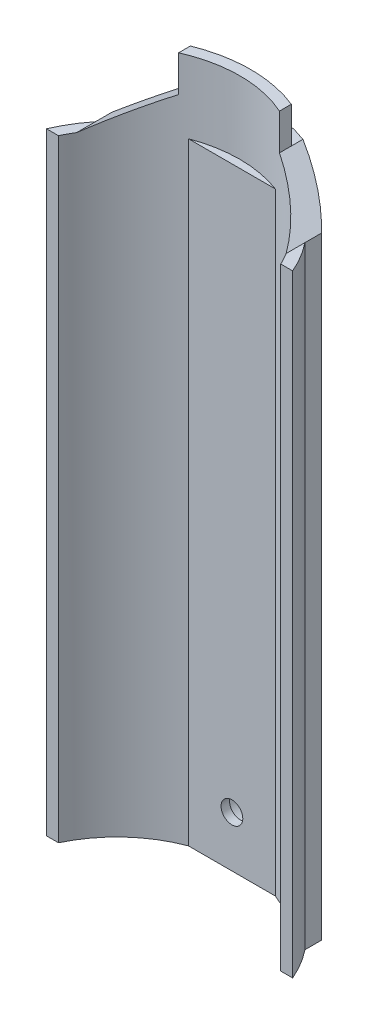
ISO-10303-21;
HEADER;
FILE_DESCRIPTION(('STEP AP214'),'2;1');
FILE_NAME('part.step','',(''),(''),'','','');
FILE_SCHEMA(('AUTOMOTIVE_DESIGN { 1 0 10303 214 1 1 1 1 }'));
ENDSEC;
DATA;
#1=APPLICATION_CONTEXT('core data for automotive mechanical design processes');
#2=APPLICATION_PROTOCOL_DEFINITION('international standard','automotive_design',2000,#1);
#3=PRODUCT_CONTEXT('',#1,'mechanical');
#4=PRODUCT('Part','Part','',(#3));
#5=PRODUCT_RELATED_PRODUCT_CATEGORY('part','',(#4));
#6=PRODUCT_DEFINITION_FORMATION('','',#4);
#7=PRODUCT_DEFINITION_CONTEXT('part definition',#1,'design');
#8=PRODUCT_DEFINITION('design','',#6,#7);
#9=PRODUCT_DEFINITION_SHAPE('','',#8);
#10=(LENGTH_UNIT() NAMED_UNIT(*) SI_UNIT(.MILLI.,.METRE.));
#11=(NAMED_UNIT(*) PLANE_ANGLE_UNIT() SI_UNIT($,.RADIAN.));
#12=(NAMED_UNIT(*) SI_UNIT($,.STERADIAN.) SOLID_ANGLE_UNIT());
#13=UNCERTAINTY_MEASURE_WITH_UNIT(LENGTH_MEASURE(1.E-05),#10,'distance_accuracy_value','');
#14=(GEOMETRIC_REPRESENTATION_CONTEXT(3) GLOBAL_UNCERTAINTY_ASSIGNED_CONTEXT((#13)) GLOBAL_UNIT_ASSIGNED_CONTEXT((#10,
#11,#12)) REPRESENTATION_CONTEXT('',''));
#15=CARTESIAN_POINT('',(0.,0.,0.));
#16=DIRECTION('',(0.,0.,1.));
#17=DIRECTION('',(1.,0.,0.));
#18=AXIS2_PLACEMENT_3D('',#15,#16,#17);
#19=CARTESIAN_POINT('',(0.,6.,-19.0787840283389));
#20=DIRECTION('',(0.,0.,-1.));
#21=DIRECTION('',(-1.,0.,0.));
#22=AXIS2_PLACEMENT_3D('',#19,#20,#21);
#23=PLANE('',#22);
#24=CARTESIAN_POINT('',(0.,-1.98446247560466,-19.0787840283389));
#25=DIRECTION('',(0.,0.,-1.));
#26=DIRECTION('',(-1.,0.,0.));
#27=AXIS2_PLACEMENT_3D('',#24,#25,#26);
#28=CIRCLE('',#27,2.6);
#29=CARTESIAN_POINT('',(-2.6,-1.98446247560466,-19.0787840283389));
#30=VERTEX_POINT('',#29);
#31=EDGE_CURVE('E445',#30,#30,#28,.T.);
#32=ORIENTED_EDGE('',*,*,#31,.F.);
#33=EDGE_LOOP('',(#32));
#34=FACE_BOUND('',#33,.T.);
#35=DIRECTION('',(0.,-1.,0.));
#36=VECTOR('',#35,1.);
#37=CARTESIAN_POINT('',(-6.,6.,-19.0787840283389));
#38=LINE('',#37,#36);
#39=CARTESIAN_POINT('',(-6.,1.25,-19.0787840283389));
#40=VERTEX_POINT('',#39);
#41=CARTESIAN_POINT('',(-6.,-9.,-19.0787840283389));
#42=VERTEX_POINT('',#41);
#43=EDGE_CURVE('E198',#40,#42,#38,.T.);
#44=ORIENTED_EDGE('',*,*,#43,.F.);
#45=DIRECTION('',(-0.64413574578278,-0.764911198117051,0.));
#46=VECTOR('',#45,1.);
#47=CARTESIAN_POINT('',(-1.17017828200972,6.98541329011345,-19.0787840283389));
#48=LINE('',#47,#46);
#49=CARTESIAN_POINT('',(-2.,6.,-19.0787840283389));
#50=VERTEX_POINT('',#49);
#51=EDGE_CURVE('E188',#50,#40,#48,.T.);
#52=ORIENTED_EDGE('',*,*,#51,.F.);
#53=DIRECTION('',(1.,0.,0.));
#54=VECTOR('',#53,1.);
#55=CARTESIAN_POINT('',(0.,6.,-19.0787840283389));
#56=LINE('',#55,#54);
#57=CARTESIAN_POINT('',(2.,6.,-19.0787840283389));
#58=VERTEX_POINT('',#57);
#59=EDGE_CURVE('E197',#50,#58,#56,.T.);
#60=ORIENTED_EDGE('',*,*,#59,.T.);
#61=DIRECTION('',(-0.64413574578278,0.764911198117051,0.));
#62=VECTOR('',#61,1.);
#63=CARTESIAN_POINT('',(1.17017828200973,6.98541329011345,-19.0787840283389));
#64=LINE('',#63,#62);
#65=CARTESIAN_POINT('',(6.,1.25,-19.0787840283389));
#66=VERTEX_POINT('',#65);
#67=EDGE_CURVE('E452',#66,#58,#64,.T.);
#68=ORIENTED_EDGE('',*,*,#67,.F.);
#69=DIRECTION('',(0.,-1.,0.));
#70=VECTOR('',#69,1.);
#71=CARTESIAN_POINT('',(6.,6.,-19.0787840283389));
#72=LINE('',#71,#70);
#73=CARTESIAN_POINT('',(6.,-9.,-19.0787840283389));
#74=VERTEX_POINT('',#73);
#75=EDGE_CURVE('E68',#66,#74,#72,.T.);
#76=ORIENTED_EDGE('',*,*,#75,.T.);
#77=DIRECTION('',(1.,0.,0.));
#78=VECTOR('',#77,1.);
#79=CARTESIAN_POINT('',(0.,-9.,-19.0787840283389));
#80=LINE('',#79,#78);
#81=EDGE_CURVE('E208',#42,#74,#80,.T.);
#82=ORIENTED_EDGE('',*,*,#81,.F.);
#83=EDGE_LOOP('',(#44,#52,#60,#68,#76,#82));
#84=FACE_BOUND('',#83,.T.);
#85=ADVANCED_FACE('F43',(#34,#84),#23,.T.);
#86=CARTESIAN_POINT('',(0.,6.,0.));
#87=DIRECTION('',(0.,1.,0.));
#88=DIRECTION('',(0.,0.,1.));
#89=AXIS2_PLACEMENT_3D('',#86,#87,#88);
#90=PLANE('',#89);
#91=DIRECTION('',(0.,0.,1.));
#92=VECTOR('',#91,1.);
#93=CARTESIAN_POINT('',(-2.,6.,-20.001));
#94=LINE('',#93,#92);
#95=CARTESIAN_POINT('',(-2.,6.00000000000001,-19.8997487421324));
#96=VERTEX_POINT('',#95);
#97=EDGE_CURVE('E185',#96,#50,#94,.T.);
#98=ORIENTED_EDGE('',*,*,#97,.F.);
#99=CARTESIAN_POINT('',(0.,6.,0.));
#100=DIRECTION('',(0.,1.,0.));
#101=DIRECTION('',(0.,0.,1.));
#102=AXIS2_PLACEMENT_3D('',#99,#100,#101);
#103=CIRCLE('',#102,20.);
#104=CARTESIAN_POINT('',(2.,6.,-19.8997487421324));
#105=VERTEX_POINT('',#104);
#106=EDGE_CURVE('E203',#105,#96,#103,.T.);
#107=ORIENTED_EDGE('',*,*,#106,.F.);
#108=DIRECTION('',(0.,0.,1.));
#109=VECTOR('',#108,1.);
#110=CARTESIAN_POINT('',(2.,6.,-20.001));
#111=LINE('',#110,#109);
#112=EDGE_CURVE('E60',#105,#58,#111,.T.);
#113=ORIENTED_EDGE('',*,*,#112,.T.);
#114=ORIENTED_EDGE('',*,*,#59,.F.);
#115=EDGE_LOOP('',(#98,#107,#113,#114));
#116=FACE_BOUND('',#115,.T.);
#117=ADVANCED_FACE('F201',(#116),#90,.F.);
#118=CARTESIAN_POINT('',(0.,-1.98446247560466,-20.));
#119=DIRECTION('',(0.,0.,1.));
#120=DIRECTION('',(1.,0.,0.));
#121=AXIS2_PLACEMENT_3D('',#118,#119,#120);
#122=CYLINDRICAL_SURFACE('',#121,1.5);
#123=CARTESIAN_POINT('',(0.,-1.98446247560466,-15.9059737205869));
#124=DIRECTION('',(0.,0.,-1.));
#125=DIRECTION('',(-1.,0.,0.));
#126=AXIS2_PLACEMENT_3D('',#123,#124,#125);
#127=CIRCLE('',#126,1.5);
#128=CARTESIAN_POINT('',(-1.5,-1.98446247560466,-15.9059737205869));
#129=VERTEX_POINT('',#128);
#130=EDGE_CURVE('E213',#129,#129,#127,.T.);
#131=ORIENTED_EDGE('',*,*,#130,.F.);
#132=EDGE_LOOP('',(#131));
#133=FACE_BOUND('',#132,.T.);
#134=CARTESIAN_POINT('',(0.,-1.98446247560466,-17.0787840283389));
#135=DIRECTION('',(0.,0.,-1.));
#136=DIRECTION('',(-1.,0.,0.));
#137=AXIS2_PLACEMENT_3D('',#134,#135,#136);
#138=CIRCLE('',#137,1.5);
#139=CARTESIAN_POINT('',(-1.5,-1.98446247560466,-17.0787840283389));
#140=VERTEX_POINT('',#139);
#141=EDGE_CURVE('E47',#140,#140,#138,.F.);
#142=ORIENTED_EDGE('',*,*,#141,.F.);
#143=EDGE_LOOP('',(#142));
#144=FACE_BOUND('',#143,.T.);
#145=ADVANCED_FACE('F469',(#133,#144),#122,.F.);
#146=CARTESIAN_POINT('',(0.,80.6,0.));
#147=DIRECTION('',(0.,-1.,0.));
#148=DIRECTION('',(0.,0.,-1.));
#149=AXIS2_PLACEMENT_3D('',#146,#147,#148);
#150=CYLINDRICAL_SURFACE('',#149,20.);
#151=CARTESIAN_POINT('',(0.,8.37500000000001,0.));
#152=DIRECTION('',(-0.764911198117051,0.64413574578278,0.));
#153=DIRECTION('',(-0.64413574578278,-0.764911198117051,0.));
#154=AXIS2_PLACEMENT_3D('',#151,#152,#153);
#155=ELLIPSE('',#154,31.0493558709356,20.);
#156=EDGE_CURVE('E190',#40,#96,#155,.F.);
#157=ORIENTED_EDGE('',*,*,#156,.F.);
#158=ORIENTED_EDGE('',*,*,#43,.T.);
#159=CARTESIAN_POINT('',(0.,-9.,0.));
#160=DIRECTION('',(0.,1.,0.));
#161=DIRECTION('',(0.,0.,1.));
#162=AXIS2_PLACEMENT_3D('',#159,#160,#161);
#163=CIRCLE('',#162,20.);
#164=CARTESIAN_POINT('',(-14.47,-9.,-13.8064876054701));
#165=VERTEX_POINT('',#164);
#166=EDGE_CURVE('E237',#42,#165,#163,.T.);
#167=ORIENTED_EDGE('',*,*,#166,.T.);
#168=DIRECTION('',(0.,-1.,0.));
#169=VECTOR('',#168,1.);
#170=CARTESIAN_POINT('',(-14.47,80.6,-13.8064876054701));
#171=LINE('',#170,#169);
#172=CARTESIAN_POINT('',(-14.47,75.6,-13.8064876054701));
#173=VERTEX_POINT('',#172);
#174=EDGE_CURVE('E370',#165,#173,#171,.F.);
#175=ORIENTED_EDGE('',*,*,#174,.T.);
#176=CARTESIAN_POINT('',(0.,85.2466666666667,0.));
#177=DIRECTION('',(0.554700196225229,-0.832050294337843,0.));
#178=DIRECTION('',(-0.832050294337843,-0.554700196225229,0.));
#179=AXIS2_PLACEMENT_3D('',#176,#177,#178);
#180=ELLIPSE('',#179,24.0370085030933,20.);
#181=CARTESIAN_POINT('',(-6.97,80.6,-18.7461756099744));
#182=VERTEX_POINT('',#181);
#183=EDGE_CURVE('E358',#173,#182,#180,.T.);
#184=ORIENTED_EDGE('',*,*,#183,.T.);
#185=CARTESIAN_POINT('',(0.,80.6,0.));
#186=DIRECTION('',(0.,1.,0.));
#187=DIRECTION('',(0.,0.,1.));
#188=AXIS2_PLACEMENT_3D('',#185,#186,#187);
#189=CIRCLE('',#188,20.);
#190=CARTESIAN_POINT('',(6.97,80.6,-18.7461756099744));
#191=VERTEX_POINT('',#190);
#192=EDGE_CURVE('E369',#191,#182,#189,.T.);
#193=ORIENTED_EDGE('',*,*,#192,.F.);
#194=CARTESIAN_POINT('',(0.,85.2466666666667,0.));
#195=DIRECTION('',(-0.554700196225229,-0.832050294337843,0.));
#196=DIRECTION('',(0.832050294337843,-0.554700196225229,0.));
#197=AXIS2_PLACEMENT_3D('',#194,#195,#196);
#198=ELLIPSE('',#197,24.0370085030933,20.);
#199=CARTESIAN_POINT('',(14.47,75.6,-13.8064876054701));
#200=VERTEX_POINT('',#199);
#201=EDGE_CURVE('E365',#191,#200,#198,.T.);
#202=ORIENTED_EDGE('',*,*,#201,.T.);
#203=DIRECTION('',(0.,-1.,0.));
#204=VECTOR('',#203,1.);
#205=CARTESIAN_POINT('',(14.47,80.6,-13.8064876054701));
#206=LINE('',#205,#204);
#207=CARTESIAN_POINT('',(14.47,-9.,-13.8064876054701));
#208=VERTEX_POINT('',#207);
#209=EDGE_CURVE('E374',#200,#208,#206,.T.);
#210=ORIENTED_EDGE('',*,*,#209,.T.);
#211=EDGE_CURVE('E238',#208,#74,#163,.T.);
#212=ORIENTED_EDGE('',*,*,#211,.T.);
#213=ORIENTED_EDGE('',*,*,#75,.F.);
#214=CARTESIAN_POINT('',(0.,8.37500000000001,0.));
#215=DIRECTION('',(0.764911198117051,0.64413574578278,0.));
#216=DIRECTION('',(0.64413574578278,-0.764911198117051,0.));
#217=AXIS2_PLACEMENT_3D('',#214,#215,#216);
#218=ELLIPSE('',#217,31.0493558709356,20.);
#219=EDGE_CURVE('E443',#105,#66,#218,.F.);
#220=ORIENTED_EDGE('',*,*,#219,.F.);
#221=ORIENTED_EDGE('',*,*,#106,.T.);
#222=EDGE_LOOP('',(#157,#158,#167,#175,#184,#193,#202,#210,#212,#213,#220,#221));
#223=FACE_BOUND('',#222,.T.);
#224=ADVANCED_FACE('F399',(#223),#150,.T.);
#225=CARTESIAN_POINT('',(0.,-9.,0.));
#226=DIRECTION('',(0.,1.,0.));
#227=DIRECTION('',(0.,0.,1.));
#228=AXIS2_PLACEMENT_3D('',#225,#226,#227);
#229=PLANE('',#228);
#230=ORIENTED_EDGE('',*,*,#81,.T.);
#231=ORIENTED_EDGE('',*,*,#211,.F.);
#232=DIRECTION('',(0.,0.,-1.));
#233=VECTOR('',#232,1.);
#234=CARTESIAN_POINT('',(14.47,-9.,-11.5268859628262));
#235=LINE('',#234,#233);
#236=CARTESIAN_POINT('',(14.47,-9.,-11.5268859628262));
#237=VERTEX_POINT('',#236);
#238=EDGE_CURVE('E266',#237,#208,#235,.T.);
#239=ORIENTED_EDGE('',*,*,#238,.F.);
#240=CARTESIAN_POINT('',(0.,-9.,0.));
#241=DIRECTION('',(0.,1.,0.));
#242=DIRECTION('',(0.,0.,1.));
#243=AXIS2_PLACEMENT_3D('',#240,#241,#242);
#244=CIRCLE('',#243,18.5);
#245=CARTESIAN_POINT('',(17.,-9.,-7.29725975966321));
#246=VERTEX_POINT('',#245);
#247=EDGE_CURVE('E262',#246,#237,#244,.T.);
#248=ORIENTED_EDGE('',*,*,#247,.F.);
#249=DIRECTION('',(1.,0.,0.));
#250=VECTOR('',#249,1.);
#251=CARTESIAN_POINT('',(15.3541525327841,-9.,-7.29725975966321));
#252=LINE('',#251,#250);
#253=CARTESIAN_POINT('',(15.3541525327841,-9.,-7.29725975966321));
#254=VERTEX_POINT('',#253);
#255=EDGE_CURVE('E258',#254,#246,#252,.T.);
#256=ORIENTED_EDGE('',*,*,#255,.F.);
#257=CARTESIAN_POINT('',(0.,-9.,0.));
#258=DIRECTION('',(0.,-1.,0.));
#259=DIRECTION('',(0.,0.,1.));
#260=AXIS2_PLACEMENT_3D('',#257,#258,#259);
#261=CIRCLE('',#260,17.);
#262=CARTESIAN_POINT('',(6.,-9.,-15.9059737205869));
#263=VERTEX_POINT('',#262);
#264=EDGE_CURVE('E254',#263,#254,#261,.T.);
#265=ORIENTED_EDGE('',*,*,#264,.F.);
#266=DIRECTION('',(1.,0.,0.));
#267=VECTOR('',#266,1.);
#268=CARTESIAN_POINT('',(0.,-9.,-15.9059737205869));
#269=LINE('',#268,#267);
#270=CARTESIAN_POINT('',(-6.,-9.,-15.9059737205869));
#271=VERTEX_POINT('',#270);
#272=EDGE_CURVE('E217',#271,#263,#269,.T.);
#273=ORIENTED_EDGE('',*,*,#272,.F.);
#274=CARTESIAN_POINT('',(-15.3541525327841,-9.,-7.2972597596632));
#275=VERTEX_POINT('',#274);
#276=EDGE_CURVE('E255',#275,#271,#261,.T.);
#277=ORIENTED_EDGE('',*,*,#276,.F.);
#278=DIRECTION('',(1.,0.,0.));
#279=VECTOR('',#278,1.);
#280=CARTESIAN_POINT('',(-17.,-9.,-7.29725975966321));
#281=LINE('',#280,#279);
#282=CARTESIAN_POINT('',(-17.,-9.,-7.29725975966321));
#283=VERTEX_POINT('',#282);
#284=EDGE_CURVE('E250',#283,#275,#281,.T.);
#285=ORIENTED_EDGE('',*,*,#284,.F.);
#286=CARTESIAN_POINT('',(0.,-9.,0.));
#287=DIRECTION('',(0.,1.,0.));
#288=DIRECTION('',(0.,0.,1.));
#289=AXIS2_PLACEMENT_3D('',#286,#287,#288);
#290=CIRCLE('',#289,18.5);
#291=CARTESIAN_POINT('',(-14.47,-9.,-11.5268859628262));
#292=VERTEX_POINT('',#291);
#293=EDGE_CURVE('E246',#292,#283,#290,.T.);
#294=ORIENTED_EDGE('',*,*,#293,.F.);
#295=DIRECTION('',(0.,0.,1.));
#296=VECTOR('',#295,1.);
#297=CARTESIAN_POINT('',(-14.47,-9.,-13.8064876054701));
#298=LINE('',#297,#296);
#299=EDGE_CURVE('E242',#165,#292,#298,.T.);
#300=ORIENTED_EDGE('',*,*,#299,.F.);
#301=ORIENTED_EDGE('',*,*,#166,.F.);
#302=EDGE_LOOP('',(#230,#231,#239,#248,#256,#265,#273,#277,#285,#294,#300,#301));
#303=FACE_BOUND('',#302,.T.);
#304=ADVANCED_FACE('F441',(#303),#229,.F.);
#305=CARTESIAN_POINT('',(0.,80.6,0.));
#306=DIRECTION('',(0.,-1.,0.));
#307=DIRECTION('',(0.,0.,-1.));
#308=AXIS2_PLACEMENT_3D('',#305,#306,#307);
#309=CYLINDRICAL_SURFACE('',#308,17.);
#310=CARTESIAN_POINT('',(0.,75.6,0.));
#311=DIRECTION('',(0.,1.,0.));
#312=DIRECTION('',(0.,0.,1.));
#313=AXIS2_PLACEMENT_3D('',#310,#311,#312);
#314=CIRCLE('',#313,17.);
#315=CARTESIAN_POINT('',(6.,75.6,-15.9059737205869));
#316=VERTEX_POINT('',#315);
#317=CARTESIAN_POINT('',(-6.,75.6,-15.9059737205869));
#318=VERTEX_POINT('',#317);
#319=EDGE_CURVE('E218',#316,#318,#314,.T.);
#320=ORIENTED_EDGE('',*,*,#319,.F.);
#321=DIRECTION('',(0.,-1.,0.));
#322=VECTOR('',#321,1.);
#323=CARTESIAN_POINT('',(6.,75.6,-15.9059737205869));
#324=LINE('',#323,#322);
#325=EDGE_CURVE('E226',#316,#263,#324,.T.);
#326=ORIENTED_EDGE('',*,*,#325,.T.);
#327=ORIENTED_EDGE('',*,*,#264,.T.);
#328=DIRECTION('',(0.,-1.,0.));
#329=VECTOR('',#328,1.);
#330=CARTESIAN_POINT('',(15.3541525327841,75.6,-7.29725975966321));
#331=LINE('',#330,#329);
#332=CARTESIAN_POINT('',(15.3541525327841,75.6,-7.29725975966321));
#333=VERTEX_POINT('',#332);
#334=EDGE_CURVE('E337',#333,#254,#331,.T.);
#335=ORIENTED_EDGE('',*,*,#334,.F.);
#336=CARTESIAN_POINT('',(0.,75.6,0.));
#337=DIRECTION('',(0.,-1.,0.));
#338=DIRECTION('',(0.,0.,1.));
#339=AXIS2_PLACEMENT_3D('',#336,#337,#338);
#340=CIRCLE('',#339,17.);
#341=CARTESIAN_POINT('',(14.47,75.6,-8.92295354689245));
#342=VERTEX_POINT('',#341);
#343=EDGE_CURVE('E312',#342,#333,#340,.T.);
#344=ORIENTED_EDGE('',*,*,#343,.F.);
#345=CARTESIAN_POINT('',(0.,85.2466666666667,0.));
#346=DIRECTION('',(-0.554700196225229,-0.832050294337843,0.));
#347=DIRECTION('',(0.832050294337843,-0.554700196225229,0.));
#348=AXIS2_PLACEMENT_3D('',#345,#346,#347);
#349=ELLIPSE('',#348,20.4314572276293,17.);
#350=CARTESIAN_POINT('',(6.97,80.6,-15.5054538792001));
#351=VERTEX_POINT('',#350);
#352=EDGE_CURVE('E362',#351,#342,#349,.T.);
#353=ORIENTED_EDGE('',*,*,#352,.F.);
#354=DIRECTION('',(0.,-1.,0.));
#355=VECTOR('',#354,1.);
#356=CARTESIAN_POINT('',(6.97,85.6,-15.5054538792001));
#357=LINE('',#356,#355);
#358=CARTESIAN_POINT('',(6.97,85.6,-15.5054538792001));
#359=VERTEX_POINT('',#358);
#360=EDGE_CURVE('E300',#359,#351,#357,.T.);
#361=ORIENTED_EDGE('',*,*,#360,.F.);
#362=CARTESIAN_POINT('',(0.,85.6,0.));
#363=DIRECTION('',(0.,1.,0.));
#364=DIRECTION('',(0.,0.,1.));
#365=AXIS2_PLACEMENT_3D('',#362,#363,#364);
#366=CIRCLE('',#365,17.);
#367=CARTESIAN_POINT('',(-6.96999999999999,85.6,-15.5054538792001));
#368=VERTEX_POINT('',#367);
#369=EDGE_CURVE('E279',#359,#368,#366,.T.);
#370=ORIENTED_EDGE('',*,*,#369,.T.);
#371=DIRECTION('',(0.,-1.,0.));
#372=VECTOR('',#371,1.);
#373=CARTESIAN_POINT('',(-6.96999999999999,85.6,-15.5054538792001));
#374=LINE('',#373,#372);
#375=CARTESIAN_POINT('',(-6.97,80.6,-15.5054538792001));
#376=VERTEX_POINT('',#375);
#377=EDGE_CURVE('E304',#368,#376,#374,.T.);
#378=ORIENTED_EDGE('',*,*,#377,.T.);
#379=CARTESIAN_POINT('',(0.,85.2466666666667,0.));
#380=DIRECTION('',(0.554700196225229,-0.832050294337843,0.));
#381=DIRECTION('',(-0.832050294337843,-0.554700196225229,0.));
#382=AXIS2_PLACEMENT_3D('',#379,#380,#381);
#383=ELLIPSE('',#382,20.4314572276293,17.);
#384=CARTESIAN_POINT('',(-14.47,75.6,-8.92295354689242));
#385=VERTEX_POINT('',#384);
#386=EDGE_CURVE('E353',#385,#376,#383,.T.);
#387=ORIENTED_EDGE('',*,*,#386,.F.);
#388=CARTESIAN_POINT('',(-15.3541525327841,75.6,-7.29725975966321));
#389=VERTEX_POINT('',#388);
#390=EDGE_CURVE('E313',#389,#385,#340,.T.);
#391=ORIENTED_EDGE('',*,*,#390,.F.);
#392=DIRECTION('',(0.,-1.,0.));
#393=VECTOR('',#392,1.);
#394=CARTESIAN_POINT('',(-15.3541525327841,75.6,-7.29725975966321));
#395=LINE('',#394,#393);
#396=EDGE_CURVE('E328',#389,#275,#395,.T.);
#397=ORIENTED_EDGE('',*,*,#396,.T.);
#398=ORIENTED_EDGE('',*,*,#276,.T.);
#399=DIRECTION('',(0.,-1.,0.));
#400=VECTOR('',#399,1.);
#401=CARTESIAN_POINT('',(-6.,75.6,-15.9059737205869));
#402=LINE('',#401,#400);
#403=EDGE_CURVE('E233',#318,#271,#402,.T.);
#404=ORIENTED_EDGE('',*,*,#403,.F.);
#405=EDGE_LOOP('',(#320,#326,#327,#335,#344,#353,#361,#370,#378,#387,#391,#397,#398,#404));
#406=FACE_BOUND('',#405,.T.);
#407=ADVANCED_FACE('F420',(#406),#309,.F.);
#408=CARTESIAN_POINT('',(14.47,0.,-20.));
#409=DIRECTION('',(-1.,0.,0.));
#410=DIRECTION('',(0.,0.,1.));
#411=AXIS2_PLACEMENT_3D('',#408,#409,#410);
#412=PLANE('',#411);
#413=DIRECTION('',(0.,-1.,0.));
#414=VECTOR('',#413,1.);
#415=CARTESIAN_POINT('',(14.47,75.6,-11.5268859628262));
#416=LINE('',#415,#414);
#417=CARTESIAN_POINT('',(14.47,75.6,-11.5268859628262));
#418=VERTEX_POINT('',#417);
#419=EDGE_CURVE('E344',#237,#418,#416,.F.);
#420=ORIENTED_EDGE('',*,*,#419,.F.);
#421=ORIENTED_EDGE('',*,*,#238,.T.);
#422=ORIENTED_EDGE('',*,*,#209,.F.);
#423=DIRECTION('',(0.,0.,1.));
#424=VECTOR('',#423,1.);
#425=CARTESIAN_POINT('',(14.47,75.6,-20.));
#426=LINE('',#425,#424);
#427=EDGE_CURVE('E11',#200,#418,#426,.T.);
#428=ORIENTED_EDGE('',*,*,#427,.T.);
#429=EDGE_LOOP('',(#420,#421,#422,#428));
#430=FACE_BOUND('',#429,.T.);
#431=ADVANCED_FACE('F438',(#430),#412,.F.);
#432=CARTESIAN_POINT('',(-14.47,0.,-20.));
#433=DIRECTION('',(1.,0.,0.));
#434=DIRECTION('',(0.,0.,-1.));
#435=AXIS2_PLACEMENT_3D('',#432,#433,#434);
#436=PLANE('',#435);
#437=DIRECTION('',(0.,-1.,0.));
#438=VECTOR('',#437,1.);
#439=CARTESIAN_POINT('',(-14.47,75.6,-11.5268859628262));
#440=LINE('',#439,#438);
#441=CARTESIAN_POINT('',(-14.47,75.6,-11.5268859628262));
#442=VERTEX_POINT('',#441);
#443=EDGE_CURVE('E341',#442,#292,#440,.T.);
#444=ORIENTED_EDGE('',*,*,#443,.F.);
#445=DIRECTION('',(0.,0.,-1.));
#446=VECTOR('',#445,1.);
#447=CARTESIAN_POINT('',(-14.47,75.6,-20.));
#448=LINE('',#447,#446);
#449=EDGE_CURVE('E377',#442,#173,#448,.T.);
#450=ORIENTED_EDGE('',*,*,#449,.T.);
#451=ORIENTED_EDGE('',*,*,#174,.F.);
#452=ORIENTED_EDGE('',*,*,#299,.T.);
#453=EDGE_LOOP('',(#444,#450,#451,#452));
#454=FACE_BOUND('',#453,.T.);
#455=ADVANCED_FACE('F393',(#454),#436,.F.);
#456=CARTESIAN_POINT('',(0.,80.6,0.));
#457=DIRECTION('',(0.,1.,0.));
#458=DIRECTION('',(0.,0.,1.));
#459=AXIS2_PLACEMENT_3D('',#456,#457,#458);
#460=PLANE('',#459);
#461=CARTESIAN_POINT('',(0.,80.6,0.));
#462=DIRECTION('',(0.,1.,0.));
#463=DIRECTION('',(0.,0.,1.));
#464=AXIS2_PLACEMENT_3D('',#461,#462,#463);
#465=CIRCLE('',#464,18.5);
#466=CARTESIAN_POINT('',(6.97,80.6,-17.1367762429227));
#467=VERTEX_POINT('',#466);
#468=CARTESIAN_POINT('',(-6.97,80.6,-17.1367762429227));
#469=VERTEX_POINT('',#468);
#470=EDGE_CURVE('E270',#467,#469,#465,.T.);
#471=ORIENTED_EDGE('',*,*,#470,.F.);
#472=DIRECTION('',(0.,0.,1.));
#473=VECTOR('',#472,1.);
#474=CARTESIAN_POINT('',(6.97,80.6,-20.));
#475=LINE('',#474,#473);
#476=EDGE_CURVE('E349',#191,#467,#475,.T.);
#477=ORIENTED_EDGE('',*,*,#476,.F.);
#478=ORIENTED_EDGE('',*,*,#192,.T.);
#479=DIRECTION('',(0.,0.,1.));
#480=VECTOR('',#479,1.);
#481=CARTESIAN_POINT('',(-6.97,80.6,-20.));
#482=LINE('',#481,#480);
#483=EDGE_CURVE('E348',#182,#469,#482,.T.);
#484=ORIENTED_EDGE('',*,*,#483,.T.);
#485=EDGE_LOOP('',(#471,#477,#478,#484));
#486=FACE_BOUND('',#485,.T.);
#487=ADVANCED_FACE('F45',(#486),#460,.T.);
#488=CARTESIAN_POINT('',(-6.97,80.6,-20.));
#489=DIRECTION('',(0.554700196225229,-0.832050294337843,0.));
#490=DIRECTION('',(0.832050294337843,0.554700196225229,0.));
#491=AXIS2_PLACEMENT_3D('',#488,#489,#490);
#492=PLANE('',#491);
#493=EDGE_CURVE('E381',#385,#442,#448,.T.);
#494=ORIENTED_EDGE('',*,*,#493,.F.);
#495=ORIENTED_EDGE('',*,*,#386,.T.);
#496=DIRECTION('',(0.,0.,-1.));
#497=VECTOR('',#496,1.);
#498=CARTESIAN_POINT('',(-6.96999999999994,80.6,0.));
#499=LINE('',#498,#497);
#500=EDGE_CURVE('E291',#376,#469,#499,.T.);
#501=ORIENTED_EDGE('',*,*,#500,.T.);
#502=ORIENTED_EDGE('',*,*,#483,.F.);
#503=ORIENTED_EDGE('',*,*,#183,.F.);
#504=ORIENTED_EDGE('',*,*,#449,.F.);
#505=EDGE_LOOP('',(#494,#495,#501,#502,#503,#504));
#506=FACE_BOUND('',#505,.T.);
#507=ADVANCED_FACE('F396',(#506),#492,.F.);
#508=CARTESIAN_POINT('',(6.97,80.6,-20.));
#509=DIRECTION('',(-0.554700196225229,-0.832050294337843,0.));
#510=DIRECTION('',(0.832050294337843,-0.554700196225229,0.));
#511=AXIS2_PLACEMENT_3D('',#508,#509,#510);
#512=PLANE('',#511);
#513=ORIENTED_EDGE('',*,*,#476,.T.);
#514=DIRECTION('',(0.,0.,1.));
#515=VECTOR('',#514,1.);
#516=CARTESIAN_POINT('',(6.97000000000001,80.6,0.));
#517=LINE('',#516,#515);
#518=EDGE_CURVE('E275',#467,#351,#517,.T.);
#519=ORIENTED_EDGE('',*,*,#518,.T.);
#520=ORIENTED_EDGE('',*,*,#352,.T.);
#521=EDGE_CURVE('E53',#418,#342,#426,.T.);
#522=ORIENTED_EDGE('',*,*,#521,.F.);
#523=ORIENTED_EDGE('',*,*,#427,.F.);
#524=ORIENTED_EDGE('',*,*,#201,.F.);
#525=EDGE_LOOP('',(#513,#519,#520,#522,#523,#524));
#526=FACE_BOUND('',#525,.T.);
#527=ADVANCED_FACE('F433',(#526),#512,.F.);
#528=CARTESIAN_POINT('',(15.3541525327841,75.6,-7.29725975966321));
#529=DIRECTION('',(0.,0.,-1.));
#530=DIRECTION('',(-1.,0.,0.));
#531=AXIS2_PLACEMENT_3D('',#528,#529,#530);
#532=PLANE('',#531);
#533=ORIENTED_EDGE('',*,*,#334,.T.);
#534=ORIENTED_EDGE('',*,*,#255,.T.);
#535=DIRECTION('',(0.,-1.,0.));
#536=VECTOR('',#535,1.);
#537=CARTESIAN_POINT('',(17.,75.6,-7.29725975966321));
#538=LINE('',#537,#536);
#539=CARTESIAN_POINT('',(17.,75.6,-7.29725975966321));
#540=VERTEX_POINT('',#539);
#541=EDGE_CURVE('E334',#540,#246,#538,.T.);
#542=ORIENTED_EDGE('',*,*,#541,.F.);
#543=DIRECTION('',(1.,0.,0.));
#544=VECTOR('',#543,1.);
#545=CARTESIAN_POINT('',(15.3541525327841,75.6,-7.29725975966321));
#546=LINE('',#545,#544);
#547=EDGE_CURVE('E317',#333,#540,#546,.T.);
#548=ORIENTED_EDGE('',*,*,#547,.F.);
#549=EDGE_LOOP('',(#533,#534,#542,#548));
#550=FACE_BOUND('',#549,.T.);
#551=ADVANCED_FACE('F519',(#550),#532,.F.);
#552=CARTESIAN_POINT('',(0.,75.6,0.));
#553=DIRECTION('',(0.,1.,0.));
#554=DIRECTION('',(0.,0.,1.));
#555=AXIS2_PLACEMENT_3D('',#552,#553,#554);
#556=PLANE('',#555);
#557=ORIENTED_EDGE('',*,*,#521,.T.);
#558=ORIENTED_EDGE('',*,*,#343,.T.);
#559=ORIENTED_EDGE('',*,*,#547,.T.);
#560=CARTESIAN_POINT('',(0.,75.6,0.));
#561=DIRECTION('',(0.,1.,0.));
#562=DIRECTION('',(0.,0.,1.));
#563=AXIS2_PLACEMENT_3D('',#560,#561,#562);
#564=CIRCLE('',#563,18.5);
#565=EDGE_CURVE('E321',#540,#418,#564,.T.);
#566=ORIENTED_EDGE('',*,*,#565,.T.);
#567=EDGE_LOOP('',(#557,#558,#559,#566));
#568=FACE_BOUND('',#567,.T.);
#569=ADVANCED_FACE('F512',(#568),#556,.T.);
#570=CARTESIAN_POINT('',(0.,75.6,0.));
#571=DIRECTION('',(0.,-1.,0.));
#572=DIRECTION('',(0.,0.,-1.));
#573=AXIS2_PLACEMENT_3D('',#570,#571,#572);
#574=CYLINDRICAL_SURFACE('',#573,18.5);
#575=ORIENTED_EDGE('',*,*,#541,.T.);
#576=ORIENTED_EDGE('',*,*,#247,.T.);
#577=ORIENTED_EDGE('',*,*,#419,.T.);
#578=ORIENTED_EDGE('',*,*,#565,.F.);
#579=EDGE_LOOP('',(#575,#576,#577,#578));
#580=FACE_BOUND('',#579,.T.);
#581=ADVANCED_FACE('F515',(#580),#574,.T.);
#582=CARTESIAN_POINT('',(-17.,75.6,-7.29725975966321));
#583=VERTEX_POINT('',#582);
#584=EDGE_CURVE('E320',#442,#583,#564,.T.);
#585=ORIENTED_EDGE('',*,*,#584,.F.);
#586=ORIENTED_EDGE('',*,*,#443,.T.);
#587=ORIENTED_EDGE('',*,*,#293,.T.);
#588=DIRECTION('',(0.,-1.,0.));
#589=VECTOR('',#588,1.);
#590=CARTESIAN_POINT('',(-17.,75.6,-7.29725975966321));
#591=LINE('',#590,#589);
#592=EDGE_CURVE('E331',#583,#283,#591,.T.);
#593=ORIENTED_EDGE('',*,*,#592,.F.);
#594=EDGE_LOOP('',(#585,#586,#587,#593));
#595=FACE_BOUND('',#594,.T.);
#596=ADVANCED_FACE('F411',(#595),#574,.T.);
#597=ORIENTED_EDGE('',*,*,#493,.T.);
#598=ORIENTED_EDGE('',*,*,#584,.T.);
#599=DIRECTION('',(1.,0.,0.));
#600=VECTOR('',#599,1.);
#601=CARTESIAN_POINT('',(-17.,75.6,-7.29725975966321));
#602=LINE('',#601,#600);
#603=EDGE_CURVE('E325',#583,#389,#602,.T.);
#604=ORIENTED_EDGE('',*,*,#603,.T.);
#605=ORIENTED_EDGE('',*,*,#390,.T.);
#606=EDGE_LOOP('',(#597,#598,#604,#605));
#607=FACE_BOUND('',#606,.T.);
#608=ADVANCED_FACE('F407',(#607),#556,.T.);
#609=CARTESIAN_POINT('',(-17.,75.6,-7.29725975966321));
#610=DIRECTION('',(0.,0.,-1.));
#611=DIRECTION('',(-1.,0.,0.));
#612=AXIS2_PLACEMENT_3D('',#609,#610,#611);
#613=PLANE('',#612);
#614=ORIENTED_EDGE('',*,*,#592,.T.);
#615=ORIENTED_EDGE('',*,*,#284,.T.);
#616=ORIENTED_EDGE('',*,*,#396,.F.);
#617=ORIENTED_EDGE('',*,*,#603,.F.);
#618=EDGE_LOOP('',(#614,#615,#616,#617));
#619=FACE_BOUND('',#618,.T.);
#620=ADVANCED_FACE('F415',(#619),#613,.F.);
#621=CARTESIAN_POINT('',(0.,85.6,0.));
#622=DIRECTION('',(0.,-1.,0.));
#623=DIRECTION('',(0.,0.,-1.));
#624=AXIS2_PLACEMENT_3D('',#621,#622,#623);
#625=CYLINDRICAL_SURFACE('',#624,18.5);
#626=ORIENTED_EDGE('',*,*,#470,.T.);
#627=DIRECTION('',(0.,-1.,0.));
#628=VECTOR('',#627,1.);
#629=CARTESIAN_POINT('',(-6.97,85.6,-17.1367762429227));
#630=LINE('',#629,#628);
#631=CARTESIAN_POINT('',(-6.97,85.6,-17.1367762429227));
#632=VERTEX_POINT('',#631);
#633=EDGE_CURVE('E308',#632,#469,#630,.T.);
#634=ORIENTED_EDGE('',*,*,#633,.F.);
#635=CARTESIAN_POINT('',(0.,85.6,0.));
#636=DIRECTION('',(0.,1.,0.));
#637=DIRECTION('',(0.,0.,1.));
#638=AXIS2_PLACEMENT_3D('',#635,#636,#637);
#639=CIRCLE('',#638,18.5);
#640=CARTESIAN_POINT('',(6.97,85.6,-17.1367762429227));
#641=VERTEX_POINT('',#640);
#642=EDGE_CURVE('E271',#641,#632,#639,.T.);
#643=ORIENTED_EDGE('',*,*,#642,.F.);
#644=DIRECTION('',(0.,-1.,0.));
#645=VECTOR('',#644,1.);
#646=CARTESIAN_POINT('',(6.97,85.6,-17.1367762429227));
#647=LINE('',#646,#645);
#648=EDGE_CURVE('E287',#641,#467,#647,.T.);
#649=ORIENTED_EDGE('',*,*,#648,.T.);
#650=EDGE_LOOP('',(#626,#634,#643,#649));
#651=FACE_BOUND('',#650,.T.);
#652=ADVANCED_FACE('F428',(#651),#625,.T.);
#653=CARTESIAN_POINT('',(-6.96999999999994,85.6,0.));
#654=DIRECTION('',(-1.,0.,0.));
#655=DIRECTION('',(0.,0.,1.));
#656=AXIS2_PLACEMENT_3D('',#653,#654,#655);
#657=PLANE('',#656);
#658=ORIENTED_EDGE('',*,*,#500,.F.);
#659=ORIENTED_EDGE('',*,*,#377,.F.);
#660=DIRECTION('',(0.,0.,-1.));
#661=VECTOR('',#660,1.);
#662=CARTESIAN_POINT('',(-6.96999999999994,85.6,0.));
#663=LINE('',#662,#661);
#664=EDGE_CURVE('E274',#368,#632,#663,.T.);
#665=ORIENTED_EDGE('',*,*,#664,.T.);
#666=ORIENTED_EDGE('',*,*,#633,.T.);
#667=EDGE_LOOP('',(#658,#659,#665,#666));
#668=FACE_BOUND('',#667,.T.);
#669=ADVANCED_FACE('F424',(#668),#657,.T.);
#670=CARTESIAN_POINT('',(6.97000000000001,85.6,0.));
#671=DIRECTION('',(1.,0.,0.));
#672=DIRECTION('',(0.,0.,-1.));
#673=AXIS2_PLACEMENT_3D('',#670,#671,#672);
#674=PLANE('',#673);
#675=ORIENTED_EDGE('',*,*,#518,.F.);
#676=ORIENTED_EDGE('',*,*,#648,.F.);
#677=DIRECTION('',(0.,0.,1.));
#678=VECTOR('',#677,1.);
#679=CARTESIAN_POINT('',(6.97000000000001,85.6,0.));
#680=LINE('',#679,#678);
#681=EDGE_CURVE('E283',#641,#359,#680,.T.);
#682=ORIENTED_EDGE('',*,*,#681,.T.);
#683=ORIENTED_EDGE('',*,*,#360,.T.);
#684=EDGE_LOOP('',(#675,#676,#682,#683));
#685=FACE_BOUND('',#684,.T.);
#686=ADVANCED_FACE('F501',(#685),#674,.T.);
#687=CARTESIAN_POINT('',(0.,85.6,0.));
#688=DIRECTION('',(0.,1.,0.));
#689=DIRECTION('',(0.,0.,1.));
#690=AXIS2_PLACEMENT_3D('',#687,#688,#689);
#691=PLANE('',#690);
#692=ORIENTED_EDGE('',*,*,#642,.T.);
#693=ORIENTED_EDGE('',*,*,#664,.F.);
#694=ORIENTED_EDGE('',*,*,#369,.F.);
#695=ORIENTED_EDGE('',*,*,#681,.F.);
#696=EDGE_LOOP('',(#692,#693,#694,#695));
#697=FACE_BOUND('',#696,.T.);
#698=ADVANCED_FACE('F496',(#697),#691,.T.);
#699=CARTESIAN_POINT('',(0.,75.6,-15.9059737205869));
#700=DIRECTION('',(0.,0.,-1.));
#701=DIRECTION('',(-1.,0.,0.));
#702=AXIS2_PLACEMENT_3D('',#699,#700,#701);
#703=PLANE('',#702);
#704=ORIENTED_EDGE('',*,*,#130,.T.);
#705=EDGE_LOOP('',(#704));
#706=FACE_BOUND('',#705,.T.);
#707=ORIENTED_EDGE('',*,*,#272,.T.);
#708=ORIENTED_EDGE('',*,*,#325,.F.);
#709=DIRECTION('',(1.,0.,0.));
#710=VECTOR('',#709,1.);
#711=CARTESIAN_POINT('',(0.,75.6,-15.9059737205869));
#712=LINE('',#711,#710);
#713=EDGE_CURVE('E222',#318,#316,#712,.T.);
#714=ORIENTED_EDGE('',*,*,#713,.F.);
#715=ORIENTED_EDGE('',*,*,#403,.T.);
#716=EDGE_LOOP('',(#707,#708,#714,#715));
#717=FACE_BOUND('',#716,.T.);
#718=ADVANCED_FACE('F492',(#706,#717),#703,.F.);
#719=CARTESIAN_POINT('',(0.,75.6,0.));
#720=DIRECTION('',(0.,1.,0.));
#721=DIRECTION('',(0.,0.,1.));
#722=AXIS2_PLACEMENT_3D('',#719,#720,#721);
#723=PLANE('',#722);
#724=ORIENTED_EDGE('',*,*,#319,.T.);
#725=ORIENTED_EDGE('',*,*,#713,.T.);
#726=EDGE_LOOP('',(#724,#725));
#727=FACE_BOUND('',#726,.T.);
#728=ADVANCED_FACE('F489',(#727),#723,.T.);
#729=CARTESIAN_POINT('',(0.,-1.98446247560466,-17.0787840283389));
#730=DIRECTION('',(0.,0.,-1.));
#731=DIRECTION('',(-1.,0.,0.));
#732=AXIS2_PLACEMENT_3D('',#729,#730,#731);
#733=PLANE('',#732);
#734=CARTESIAN_POINT('',(0.,-1.98446247560466,-17.0787840283389));
#735=DIRECTION('',(0.,0.,-1.));
#736=DIRECTION('',(-1.,0.,0.));
#737=AXIS2_PLACEMENT_3D('',#734,#735,#736);
#738=CIRCLE('',#737,2.6);
#739=CARTESIAN_POINT('',(-2.6,-1.98446247560466,-17.0787840283389));
#740=VERTEX_POINT('',#739);
#741=EDGE_CURVE('E450',#740,#740,#738,.T.);
#742=ORIENTED_EDGE('',*,*,#741,.T.);
#743=EDGE_LOOP('',(#742));
#744=FACE_BOUND('',#743,.T.);
#745=ORIENTED_EDGE('',*,*,#141,.T.);
#746=EDGE_LOOP('',(#745));
#747=FACE_BOUND('',#746,.T.);
#748=ADVANCED_FACE('F467',(#744,#747),#733,.T.);
#749=CARTESIAN_POINT('',(0.,-1.98446247560466,-17.0787840283389));
#750=DIRECTION('',(0.,0.,-1.));
#751=DIRECTION('',(-1.,0.,0.));
#752=AXIS2_PLACEMENT_3D('',#749,#750,#751);
#753=CYLINDRICAL_SURFACE('',#752,2.6);
#754=ORIENTED_EDGE('',*,*,#741,.F.);
#755=EDGE_LOOP('',(#754));
#756=FACE_BOUND('',#755,.T.);
#757=ORIENTED_EDGE('',*,*,#31,.T.);
#758=EDGE_LOOP('',(#757));
#759=FACE_BOUND('',#758,.T.);
#760=ADVANCED_FACE('F603',(#756,#759),#753,.F.);
#761=CARTESIAN_POINT('',(1.17017828200973,6.98541329011345,-20.001));
#762=DIRECTION('',(0.764911198117051,0.64413574578278,0.));
#763=DIRECTION('',(-0.64413574578278,0.764911198117051,0.));
#764=AXIS2_PLACEMENT_3D('',#761,#762,#763);
#765=PLANE('',#764);
#766=ORIENTED_EDGE('',*,*,#112,.F.);
#767=ORIENTED_EDGE('',*,*,#219,.T.);
#768=ORIENTED_EDGE('',*,*,#67,.T.);
#769=EDGE_LOOP('',(#766,#767,#768));
#770=FACE_BOUND('',#769,.T.);
#771=ADVANCED_FACE('F611',(#770),#765,.F.);
#772=CARTESIAN_POINT('',(-1.17017828200972,6.98541329011345,-20.001));
#773=DIRECTION('',(-0.764911198117051,0.64413574578278,0.));
#774=DIRECTION('',(-0.64413574578278,-0.764911198117051,0.));
#775=AXIS2_PLACEMENT_3D('',#772,#773,#774);
#776=PLANE('',#775);
#777=ORIENTED_EDGE('',*,*,#51,.T.);
#778=ORIENTED_EDGE('',*,*,#156,.T.);
#779=ORIENTED_EDGE('',*,*,#97,.T.);
#780=EDGE_LOOP('',(#777,#778,#779));
#781=FACE_BOUND('',#780,.T.);
#782=ADVANCED_FACE('F187',(#781),#776,.F.);
#783=CLOSED_SHELL('',(#85,#117,#145,#224,#304,#407,#431,#455,#487,#507,#527,#551,#569,#581,#596,
#608,#620,#652,#669,#686,#698,#718,#728,#748,#760,#771,#782));
#784=MANIFOLD_SOLID_BREP('B2',#783);
#785=ADVANCED_BREP_SHAPE_REPRESENTATION('',(#18,#784),#14);
#786=SHAPE_DEFINITION_REPRESENTATION(#9,#785);
ENDSEC;
END-ISO-10303-21;
